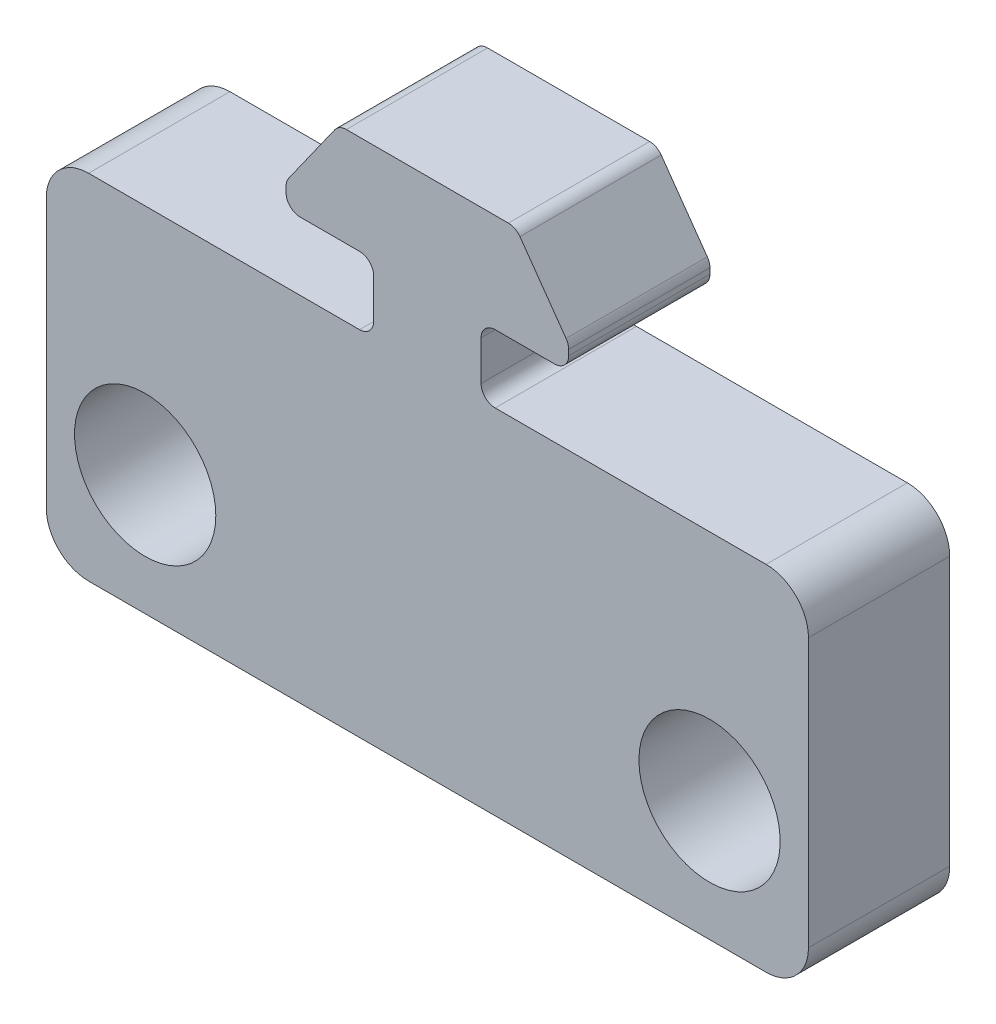
ISO-10303-21;
HEADER;
FILE_DESCRIPTION(('STEP AP214'),'2;1');
FILE_NAME('part.step','',(''),(''),'','','');
FILE_SCHEMA(('AUTOMOTIVE_DESIGN { 1 0 10303 214 1 1 1 1 }'));
ENDSEC;
DATA;
#1=APPLICATION_CONTEXT('core data for automotive mechanical design processes');
#2=APPLICATION_PROTOCOL_DEFINITION('international standard','automotive_design',2000,#1);
#3=PRODUCT_CONTEXT('',#1,'mechanical');
#4=PRODUCT('Part','Part','',(#3));
#5=PRODUCT_RELATED_PRODUCT_CATEGORY('part','',(#4));
#6=PRODUCT_DEFINITION_FORMATION('','',#4);
#7=PRODUCT_DEFINITION_CONTEXT('part definition',#1,'design');
#8=PRODUCT_DEFINITION('design','',#6,#7);
#9=PRODUCT_DEFINITION_SHAPE('','',#8);
#10=(LENGTH_UNIT() NAMED_UNIT(*) SI_UNIT(.MILLI.,.METRE.));
#11=(NAMED_UNIT(*) PLANE_ANGLE_UNIT() SI_UNIT($,.RADIAN.));
#12=(NAMED_UNIT(*) SI_UNIT($,.STERADIAN.) SOLID_ANGLE_UNIT());
#13=UNCERTAINTY_MEASURE_WITH_UNIT(LENGTH_MEASURE(1.E-05),#10,'distance_accuracy_value','');
#14=(GEOMETRIC_REPRESENTATION_CONTEXT(3) GLOBAL_UNCERTAINTY_ASSIGNED_CONTEXT((#13)) GLOBAL_UNIT_ASSIGNED_CONTEXT((#10,
#11,#12)) REPRESENTATION_CONTEXT('',''));
#15=CARTESIAN_POINT('',(0.,0.,0.));
#16=DIRECTION('',(0.,0.,1.));
#17=DIRECTION('',(1.,0.,0.));
#18=AXIS2_PLACEMENT_3D('',#15,#16,#17);
#19=CARTESIAN_POINT('',(0.,0.,10.));
#20=DIRECTION('',(0.,-1.,0.));
#21=DIRECTION('',(0.,0.,-1.));
#22=AXIS2_PLACEMENT_3D('',#19,#20,#21);
#23=PLANE('',#22);
#24=DIRECTION('',(-1.,0.,0.));
#25=VECTOR('',#24,1.);
#26=CARTESIAN_POINT('',(0.,0.,10.));
#27=LINE('',#26,#25);
#28=CARTESIAN_POINT('',(9.,0.,10.));
#29=VERTEX_POINT('',#28);
#30=CARTESIAN_POINT('',(4.8,0.,10.));
#31=VERTEX_POINT('',#30);
#32=EDGE_CURVE('E244',#29,#31,#27,.T.);
#33=ORIENTED_EDGE('',*,*,#32,.T.);
#34=DIRECTION('',(0.,0.,-1.));
#35=VECTOR('',#34,1.);
#36=CARTESIAN_POINT('',(4.8,0.,0.));
#37=LINE('',#36,#35);
#38=CARTESIAN_POINT('',(4.8,0.,0.));
#39=VERTEX_POINT('',#38);
#40=EDGE_CURVE('E349',#31,#39,#37,.T.);
#41=ORIENTED_EDGE('',*,*,#40,.T.);
#42=DIRECTION('',(-1.,0.,0.));
#43=VECTOR('',#42,1.);
#44=CARTESIAN_POINT('',(0.,0.,0.));
#45=LINE('',#44,#43);
#46=CARTESIAN_POINT('',(9.,0.,0.));
#47=VERTEX_POINT('',#46);
#48=EDGE_CURVE('E494',#47,#39,#45,.T.);
#49=ORIENTED_EDGE('',*,*,#48,.F.);
#50=DIRECTION('',(0.,0.,-1.));
#51=VECTOR('',#50,1.);
#52=CARTESIAN_POINT('',(9.,0.,10.));
#53=LINE('',#52,#51);
#54=EDGE_CURVE('E336',#47,#29,#53,.F.);
#55=ORIENTED_EDGE('',*,*,#54,.T.);
#56=EDGE_LOOP('',(#33,#41,#49,#55));
#57=FACE_BOUND('',#56,.T.);
#58=ADVANCED_FACE('F47',(#57),#23,.T.);
#59=CARTESIAN_POINT('',(-4.8,0.,0.));
#60=VERTEX_POINT('',#59);
#61=CARTESIAN_POINT('',(-9.,0.,0.));
#62=VERTEX_POINT('',#61);
#63=EDGE_CURVE('E499',#60,#62,#45,.T.);
#64=ORIENTED_EDGE('',*,*,#63,.F.);
#65=DIRECTION('',(0.,0.,-1.));
#66=VECTOR('',#65,1.);
#67=CARTESIAN_POINT('',(-4.8,0.,10.));
#68=LINE('',#67,#66);
#69=CARTESIAN_POINT('',(-4.8,0.,10.));
#70=VERTEX_POINT('',#69);
#71=EDGE_CURVE('E241',#60,#70,#68,.F.);
#72=ORIENTED_EDGE('',*,*,#71,.T.);
#73=CARTESIAN_POINT('',(-9.,0.,10.));
#74=VERTEX_POINT('',#73);
#75=EDGE_CURVE('E234',#70,#74,#27,.T.);
#76=ORIENTED_EDGE('',*,*,#75,.T.);
#77=DIRECTION('',(0.,0.,-1.));
#78=VECTOR('',#77,1.);
#79=CARTESIAN_POINT('',(-9.,0.,10.));
#80=LINE('',#79,#78);
#81=EDGE_CURVE('E239',#74,#62,#80,.T.);
#82=ORIENTED_EDGE('',*,*,#81,.T.);
#83=EDGE_LOOP('',(#64,#72,#76,#82));
#84=FACE_BOUND('',#83,.T.);
#85=ADVANCED_FACE('F237',(#84),#23,.T.);
#86=CARTESIAN_POINT('',(10.,0.,10.));
#87=DIRECTION('',(-1.,0.,0.));
#88=DIRECTION('',(0.,0.,1.));
#89=AXIS2_PLACEMENT_3D('',#86,#87,#88);
#90=PLANE('',#89);
#91=DIRECTION('',(0.,1.,0.));
#92=VECTOR('',#91,1.);
#93=CARTESIAN_POINT('',(10.,0.,10.));
#94=LINE('',#93,#92);
#95=CARTESIAN_POINT('',(10.,1.,10.));
#96=VERTEX_POINT('',#95);
#97=CARTESIAN_POINT('',(10.,1.39179018720823,10.));
#98=VERTEX_POINT('',#97);
#99=EDGE_CURVE('E479',#96,#98,#94,.T.);
#100=ORIENTED_EDGE('',*,*,#99,.F.);
#101=DIRECTION('',(0.,0.,-1.));
#102=VECTOR('',#101,1.);
#103=CARTESIAN_POINT('',(10.,1.,0.));
#104=LINE('',#103,#102);
#105=CARTESIAN_POINT('',(10.,1.,0.));
#106=VERTEX_POINT('',#105);
#107=EDGE_CURVE('E332',#96,#106,#104,.T.);
#108=ORIENTED_EDGE('',*,*,#107,.T.);
#109=DIRECTION('',(0.,1.,0.));
#110=VECTOR('',#109,1.);
#111=CARTESIAN_POINT('',(10.,0.,0.));
#112=LINE('',#111,#110);
#113=CARTESIAN_POINT('',(10.,1.39179018720823,0.));
#114=VERTEX_POINT('',#113);
#115=EDGE_CURVE('E498',#106,#114,#112,.T.);
#116=ORIENTED_EDGE('',*,*,#115,.T.);
#117=DIRECTION('',(0.,0.,-1.));
#118=VECTOR('',#117,1.);
#119=CARTESIAN_POINT('',(10.,1.39179018720823,10.));
#120=LINE('',#119,#118);
#121=EDGE_CURVE('E329',#114,#98,#120,.F.);
#122=ORIENTED_EDGE('',*,*,#121,.T.);
#123=EDGE_LOOP('',(#100,#108,#116,#122));
#124=FACE_BOUND('',#123,.T.);
#125=ADVANCED_FACE('F553',(#124),#90,.F.);
#126=CARTESIAN_POINT('',(7.46765073306512,5.28686501844186,10.));
#127=DIRECTION('',(-0.816164723344739,-0.57781930079187,0.));
#128=DIRECTION('',(0.57781930079187,-0.816164723344739,0.));
#129=AXIS2_PLACEMENT_3D('',#126,#127,#128);
#130=PLANE('',#129);
#131=DIRECTION('',(-0.57781930079187,0.816164723344739,0.));
#132=VECTOR('',#131,1.);
#133=CARTESIAN_POINT('',(7.46765073306512,5.28686501844186,0.));
#134=LINE('',#133,#132);
#135=CARTESIAN_POINT('',(9.81616472334474,1.9696094880001,0.));
#136=VERTEX_POINT('',#135);
#137=CARTESIAN_POINT('',(6.55369515590563,6.57781930079187,0.));
#138=VERTEX_POINT('',#137);
#139=EDGE_CURVE('E503',#136,#138,#134,.T.);
#140=ORIENTED_EDGE('',*,*,#139,.T.);
#141=DIRECTION('',(0.,0.,-1.));
#142=VECTOR('',#141,1.);
#143=CARTESIAN_POINT('',(6.55369515590563,6.57781930079187,10.));
#144=LINE('',#143,#142);
#145=CARTESIAN_POINT('',(6.55369515590563,6.57781930079187,10.));
#146=VERTEX_POINT('',#145);
#147=EDGE_CURVE('E326',#138,#146,#144,.F.);
#148=ORIENTED_EDGE('',*,*,#147,.T.);
#149=DIRECTION('',(-0.57781930079187,0.816164723344739,0.));
#150=VECTOR('',#149,1.);
#151=CARTESIAN_POINT('',(7.46765073306512,5.28686501844186,10.));
#152=LINE('',#151,#150);
#153=CARTESIAN_POINT('',(9.81616472334474,1.9696094880001,10.));
#154=VERTEX_POINT('',#153);
#155=EDGE_CURVE('E483',#154,#146,#152,.T.);
#156=ORIENTED_EDGE('',*,*,#155,.F.);
#157=DIRECTION('',(0.,0.,-1.));
#158=VECTOR('',#157,1.);
#159=CARTESIAN_POINT('',(9.81616472334474,1.9696094880001,10.));
#160=LINE('',#159,#158);
#161=EDGE_CURVE('E322',#154,#136,#160,.T.);
#162=ORIENTED_EDGE('',*,*,#161,.T.);
#163=EDGE_LOOP('',(#140,#148,#156,#162));
#164=FACE_BOUND('',#163,.T.);
#165=ADVANCED_FACE('F543',(#164),#130,.F.);
#166=CARTESIAN_POINT('',(0.,7.,10.));
#167=DIRECTION('',(0.,1.,0.));
#168=DIRECTION('',(0.,0.,1.));
#169=AXIS2_PLACEMENT_3D('',#166,#167,#168);
#170=PLANE('',#169);
#171=DIRECTION('',(1.,0.,0.));
#172=VECTOR('',#171,1.);
#173=CARTESIAN_POINT('',(0.,7.,0.));
#174=LINE('',#173,#172);
#175=CARTESIAN_POINT('',(-5.73753043256089,7.,0.));
#176=VERTEX_POINT('',#175);
#177=CARTESIAN_POINT('',(5.73753043256089,7.,0.));
#178=VERTEX_POINT('',#177);
#179=EDGE_CURVE('E507',#176,#178,#174,.T.);
#180=ORIENTED_EDGE('',*,*,#179,.F.);
#181=DIRECTION('',(0.,0.,-1.));
#182=VECTOR('',#181,1.);
#183=CARTESIAN_POINT('',(-5.73753043256089,7.,10.));
#184=LINE('',#183,#182);
#185=CARTESIAN_POINT('',(-5.73753043256089,7.,10.));
#186=VERTEX_POINT('',#185);
#187=EDGE_CURVE('E319',#176,#186,#184,.F.);
#188=ORIENTED_EDGE('',*,*,#187,.T.);
#189=DIRECTION('',(1.,0.,0.));
#190=VECTOR('',#189,1.);
#191=CARTESIAN_POINT('',(0.,7.,10.));
#192=LINE('',#191,#190);
#193=CARTESIAN_POINT('',(5.73753043256089,7.,10.));
#194=VERTEX_POINT('',#193);
#195=EDGE_CURVE('E487',#186,#194,#192,.T.);
#196=ORIENTED_EDGE('',*,*,#195,.T.);
#197=DIRECTION('',(0.,0.,-1.));
#198=VECTOR('',#197,1.);
#199=CARTESIAN_POINT('',(5.73753043256089,7.,0.));
#200=LINE('',#199,#198);
#201=EDGE_CURVE('E315',#194,#178,#200,.T.);
#202=ORIENTED_EDGE('',*,*,#201,.T.);
#203=EDGE_LOOP('',(#180,#188,#196,#202));
#204=FACE_BOUND('',#203,.T.);
#205=ADVANCED_FACE('F535',(#204),#170,.T.);
#206=CARTESIAN_POINT('',(-7.46765073306512,5.28686501844186,10.));
#207=DIRECTION('',(-0.816164723344739,0.57781930079187,0.));
#208=DIRECTION('',(-0.57781930079187,-0.816164723344739,0.));
#209=AXIS2_PLACEMENT_3D('',#206,#207,#208);
#210=PLANE('',#209);
#211=DIRECTION('',(0.57781930079187,0.816164723344739,0.));
#212=VECTOR('',#211,1.);
#213=CARTESIAN_POINT('',(-7.46765073306512,5.28686501844186,0.));
#214=LINE('',#213,#212);
#215=CARTESIAN_POINT('',(-9.81616472334474,1.9696094880001,0.));
#216=VERTEX_POINT('',#215);
#217=CARTESIAN_POINT('',(-6.55369515590563,6.57781930079187,0.));
#218=VERTEX_POINT('',#217);
#219=EDGE_CURVE('E510',#216,#218,#214,.T.);
#220=ORIENTED_EDGE('',*,*,#219,.F.);
#221=DIRECTION('',(0.,0.,-1.));
#222=VECTOR('',#221,1.);
#223=CARTESIAN_POINT('',(-9.81616472334474,1.9696094880001,10.));
#224=LINE('',#223,#222);
#225=CARTESIAN_POINT('',(-9.81616472334474,1.9696094880001,10.));
#226=VERTEX_POINT('',#225);
#227=EDGE_CURVE('E312',#216,#226,#224,.F.);
#228=ORIENTED_EDGE('',*,*,#227,.T.);
#229=DIRECTION('',(0.57781930079187,0.816164723344739,0.));
#230=VECTOR('',#229,1.);
#231=CARTESIAN_POINT('',(-7.46765073306512,5.28686501844186,10.));
#232=LINE('',#231,#230);
#233=CARTESIAN_POINT('',(-6.55369515590563,6.57781930079187,10.));
#234=VERTEX_POINT('',#233);
#235=EDGE_CURVE('E270',#226,#234,#232,.T.);
#236=ORIENTED_EDGE('',*,*,#235,.T.);
#237=DIRECTION('',(0.,0.,-1.));
#238=VECTOR('',#237,1.);
#239=CARTESIAN_POINT('',(-6.55369515590563,6.57781930079187,10.));
#240=LINE('',#239,#238);
#241=EDGE_CURVE('E257',#234,#218,#240,.T.);
#242=ORIENTED_EDGE('',*,*,#241,.T.);
#243=EDGE_LOOP('',(#220,#228,#236,#242));
#244=FACE_BOUND('',#243,.T.);
#245=ADVANCED_FACE('F526',(#244),#210,.T.);
#246=CARTESIAN_POINT('',(-10.,0.,10.));
#247=DIRECTION('',(-1.,0.,0.));
#248=DIRECTION('',(0.,0.,1.));
#249=AXIS2_PLACEMENT_3D('',#246,#247,#248);
#250=PLANE('',#249);
#251=DIRECTION('',(0.,1.,0.));
#252=VECTOR('',#251,1.);
#253=CARTESIAN_POINT('',(-10.,0.,0.));
#254=LINE('',#253,#252);
#255=CARTESIAN_POINT('',(-10.,1.,0.));
#256=VERTEX_POINT('',#255);
#257=CARTESIAN_POINT('',(-10.,1.39179018720823,0.));
#258=VERTEX_POINT('',#257);
#259=EDGE_CURVE('E245',#256,#258,#254,.T.);
#260=ORIENTED_EDGE('',*,*,#259,.F.);
#261=DIRECTION('',(0.,0.,-1.));
#262=VECTOR('',#261,1.);
#263=CARTESIAN_POINT('',(-10.,1.,10.));
#264=LINE('',#263,#262);
#265=CARTESIAN_POINT('',(-10.,1.,10.));
#266=VERTEX_POINT('',#265);
#267=EDGE_CURVE('E292',#256,#266,#264,.F.);
#268=ORIENTED_EDGE('',*,*,#267,.T.);
#269=DIRECTION('',(0.,1.,0.));
#270=VECTOR('',#269,1.);
#271=CARTESIAN_POINT('',(-10.,0.,10.));
#272=LINE('',#271,#270);
#273=CARTESIAN_POINT('',(-10.,1.39179018720823,10.));
#274=VERTEX_POINT('',#273);
#275=EDGE_CURVE('E253',#266,#274,#272,.T.);
#276=ORIENTED_EDGE('',*,*,#275,.T.);
#277=DIRECTION('',(0.,0.,-1.));
#278=VECTOR('',#277,1.);
#279=CARTESIAN_POINT('',(-10.,1.39179018720823,10.));
#280=LINE('',#279,#278);
#281=EDGE_CURVE('E288',#274,#258,#280,.T.);
#282=ORIENTED_EDGE('',*,*,#281,.T.);
#283=EDGE_LOOP('',(#260,#268,#276,#282));
#284=FACE_BOUND('',#283,.T.);
#285=ADVANCED_FACE('F518',(#284),#250,.T.);
#286=CARTESIAN_POINT('',(0.,0.,10.));
#287=DIRECTION('',(0.,0.,1.));
#288=DIRECTION('',(1.,0.,0.));
#289=AXIS2_PLACEMENT_3D('',#286,#287,#288);
#290=PLANE('',#289);
#291=CARTESIAN_POINT('',(-19.9733887839906,-21.2885545569876,10.));
#292=DIRECTION('',(0.,0.,1.));
#293=DIRECTION('',(1.,0.,0.));
#294=AXIS2_PLACEMENT_3D('',#291,#292,#293);
#295=CIRCLE('',#294,5.);
#296=CARTESIAN_POINT('',(-14.9733887839906,-21.2885545569876,10.));
#297=VERTEX_POINT('',#296);
#298=EDGE_CURVE('E457',#297,#297,#295,.T.);
#299=ORIENTED_EDGE('',*,*,#298,.F.);
#300=EDGE_LOOP('',(#299));
#301=FACE_BOUND('',#300,.T.);
#302=CARTESIAN_POINT('',(19.9733887839906,-21.2885545569876,10.));
#303=DIRECTION('',(0.,0.,1.));
#304=DIRECTION('',(-1.,0.,0.));
#305=AXIS2_PLACEMENT_3D('',#302,#303,#304);
#306=CIRCLE('',#305,5.);
#307=CARTESIAN_POINT('',(14.9733887839906,-21.2885545569876,10.));
#308=VERTEX_POINT('',#307);
#309=EDGE_CURVE('E920',#308,#308,#306,.T.);
#310=ORIENTED_EDGE('',*,*,#309,.F.);
#311=EDGE_LOOP('',(#310));
#312=FACE_BOUND('',#311,.T.);
#313=DIRECTION('',(-1.,0.,0.));
#314=VECTOR('',#313,1.);
#315=CARTESIAN_POINT('',(0.,-4.8,10.));
#316=LINE('',#315,#314);
#317=CARTESIAN_POINT('',(-4.8,-4.8,10.));
#318=VERTEX_POINT('',#317);
#319=CARTESIAN_POINT('',(-23.9733887839906,-4.8,10.));
#320=VERTEX_POINT('',#319);
#321=EDGE_CURVE('E599',#318,#320,#316,.T.);
#322=ORIENTED_EDGE('',*,*,#321,.T.);
#323=CARTESIAN_POINT('',(-23.9733887839906,-7.8,10.));
#324=DIRECTION('',(0.,0.,1.));
#325=DIRECTION('',(1.,0.,0.));
#326=AXIS2_PLACEMENT_3D('',#323,#324,#325);
#327=CIRCLE('',#326,3.);
#328=CARTESIAN_POINT('',(-26.9733887839906,-7.8,10.));
#329=VERTEX_POINT('',#328);
#330=EDGE_CURVE('E419',#320,#329,#327,.T.);
#331=ORIENTED_EDGE('',*,*,#330,.T.);
#332=DIRECTION('',(0.,-1.,0.));
#333=VECTOR('',#332,1.);
#334=CARTESIAN_POINT('',(-26.9733887839906,0.,10.));
#335=LINE('',#334,#333);
#336=CARTESIAN_POINT('',(-26.9733887839905,-26.8,10.));
#337=VERTEX_POINT('',#336);
#338=EDGE_CURVE('E601',#329,#337,#335,.T.);
#339=ORIENTED_EDGE('',*,*,#338,.T.);
#340=CARTESIAN_POINT('',(-23.9733887839905,-26.8,10.));
#341=DIRECTION('',(0.,0.,1.));
#342=DIRECTION('',(1.,0.,0.));
#343=AXIS2_PLACEMENT_3D('',#340,#341,#342);
#344=CIRCLE('',#343,3.);
#345=CARTESIAN_POINT('',(-23.9733887839905,-29.8,10.));
#346=VERTEX_POINT('',#345);
#347=EDGE_CURVE('E416',#337,#346,#344,.T.);
#348=ORIENTED_EDGE('',*,*,#347,.T.);
#349=DIRECTION('',(1.,0.,0.));
#350=VECTOR('',#349,1.);
#351=CARTESIAN_POINT('',(0.,-29.8,10.));
#352=LINE('',#351,#350);
#353=CARTESIAN_POINT('',(23.9733887839906,-29.8,10.));
#354=VERTEX_POINT('',#353);
#355=EDGE_CURVE('E475',#346,#354,#352,.T.);
#356=ORIENTED_EDGE('',*,*,#355,.T.);
#357=CARTESIAN_POINT('',(23.9733887839906,-26.8,10.));
#358=DIRECTION('',(0.,0.,1.));
#359=DIRECTION('',(1.,0.,0.));
#360=AXIS2_PLACEMENT_3D('',#357,#358,#359);
#361=CIRCLE('',#360,3.);
#362=CARTESIAN_POINT('',(26.9733887839906,-26.8,10.));
#363=VERTEX_POINT('',#362);
#364=EDGE_CURVE('E69',#354,#363,#361,.T.);
#365=ORIENTED_EDGE('',*,*,#364,.T.);
#366=DIRECTION('',(0.,-1.,0.));
#367=VECTOR('',#366,1.);
#368=CARTESIAN_POINT('',(26.9733887839906,0.,10.));
#369=LINE('',#368,#367);
#370=CARTESIAN_POINT('',(26.9733887839906,-7.8,10.));
#371=VERTEX_POINT('',#370);
#372=EDGE_CURVE('E441',#371,#363,#369,.T.);
#373=ORIENTED_EDGE('',*,*,#372,.F.);
#374=CARTESIAN_POINT('',(23.9733887839906,-7.8,10.));
#375=DIRECTION('',(0.,0.,1.));
#376=DIRECTION('',(1.,0.,0.));
#377=AXIS2_PLACEMENT_3D('',#374,#375,#376);
#378=CIRCLE('',#377,3.);
#379=CARTESIAN_POINT('',(23.9733887839906,-4.8,10.));
#380=VERTEX_POINT('',#379);
#381=EDGE_CURVE('E63',#371,#380,#378,.T.);
#382=ORIENTED_EDGE('',*,*,#381,.T.);
#383=DIRECTION('',(1.,0.,0.));
#384=VECTOR('',#383,1.);
#385=CARTESIAN_POINT('',(0.,-4.8,10.));
#386=LINE('',#385,#384);
#387=CARTESIAN_POINT('',(4.8,-4.8,10.));
#388=VERTEX_POINT('',#387);
#389=EDGE_CURVE('E582',#388,#380,#386,.T.);
#390=ORIENTED_EDGE('',*,*,#389,.F.);
#391=CARTESIAN_POINT('',(4.8,-3.8,10.));
#392=DIRECTION('',(0.,0.,1.));
#393=DIRECTION('',(1.,0.,0.));
#394=AXIS2_PLACEMENT_3D('',#391,#392,#393);
#395=CIRCLE('',#394,1.);
#396=CARTESIAN_POINT('',(3.8,-3.8,10.));
#397=VERTEX_POINT('',#396);
#398=EDGE_CURVE('E369',#388,#397,#395,.F.);
#399=ORIENTED_EDGE('',*,*,#398,.T.);
#400=DIRECTION('',(0.,-1.,0.));
#401=VECTOR('',#400,1.);
#402=CARTESIAN_POINT('',(3.8,0.,10.));
#403=LINE('',#402,#401);
#404=CARTESIAN_POINT('',(3.8,-1.,10.));
#405=VERTEX_POINT('',#404);
#406=EDGE_CURVE('E573',#405,#397,#403,.T.);
#407=ORIENTED_EDGE('',*,*,#406,.F.);
#408=CARTESIAN_POINT('',(4.8,-1.,10.));
#409=DIRECTION('',(0.,0.,1.));
#410=DIRECTION('',(1.,0.,0.));
#411=AXIS2_PLACEMENT_3D('',#408,#409,#410);
#412=CIRCLE('',#411,1.);
#413=EDGE_CURVE('E375',#405,#31,#412,.F.);
#414=ORIENTED_EDGE('',*,*,#413,.T.);
#415=ORIENTED_EDGE('',*,*,#32,.F.);
#416=CARTESIAN_POINT('',(9.,1.,10.));
#417=DIRECTION('',(0.,0.,1.));
#418=DIRECTION('',(1.,0.,0.));
#419=AXIS2_PLACEMENT_3D('',#416,#417,#418);
#420=CIRCLE('',#419,1.);
#421=EDGE_CURVE('E298',#29,#96,#420,.T.);
#422=ORIENTED_EDGE('',*,*,#421,.T.);
#423=ORIENTED_EDGE('',*,*,#99,.T.);
#424=CARTESIAN_POINT('',(9.,1.39179018720823,10.));
#425=DIRECTION('',(0.,0.,1.));
#426=DIRECTION('',(1.,0.,0.));
#427=AXIS2_PLACEMENT_3D('',#424,#425,#426);
#428=CIRCLE('',#427,1.);
#429=EDGE_CURVE('E295',#98,#154,#428,.T.);
#430=ORIENTED_EDGE('',*,*,#429,.T.);
#431=ORIENTED_EDGE('',*,*,#155,.T.);
#432=CARTESIAN_POINT('',(5.73753043256089,6.,10.));
#433=DIRECTION('',(0.,0.,1.));
#434=DIRECTION('',(1.,0.,0.));
#435=AXIS2_PLACEMENT_3D('',#432,#433,#434);
#436=CIRCLE('',#435,1.);
#437=EDGE_CURVE('E301',#146,#194,#436,.T.);
#438=ORIENTED_EDGE('',*,*,#437,.T.);
#439=ORIENTED_EDGE('',*,*,#195,.F.);
#440=CARTESIAN_POINT('',(-5.73753043256089,6.,10.));
#441=DIRECTION('',(0.,0.,1.));
#442=DIRECTION('',(1.,0.,0.));
#443=AXIS2_PLACEMENT_3D('',#440,#441,#442);
#444=CIRCLE('',#443,1.);
#445=EDGE_CURVE('E304',#186,#234,#444,.T.);
#446=ORIENTED_EDGE('',*,*,#445,.T.);
#447=ORIENTED_EDGE('',*,*,#235,.F.);
#448=CARTESIAN_POINT('',(-9.,1.39179018720823,10.));
#449=DIRECTION('',(0.,0.,1.));
#450=DIRECTION('',(1.,0.,0.));
#451=AXIS2_PLACEMENT_3D('',#448,#449,#450);
#452=CIRCLE('',#451,1.);
#453=EDGE_CURVE('E258',#226,#274,#452,.T.);
#454=ORIENTED_EDGE('',*,*,#453,.T.);
#455=ORIENTED_EDGE('',*,*,#275,.F.);
#456=CARTESIAN_POINT('',(-9.,1.,10.));
#457=DIRECTION('',(0.,0.,1.));
#458=DIRECTION('',(1.,0.,0.));
#459=AXIS2_PLACEMENT_3D('',#456,#457,#458);
#460=CIRCLE('',#459,1.);
#461=EDGE_CURVE('E249',#266,#74,#460,.T.);
#462=ORIENTED_EDGE('',*,*,#461,.T.);
#463=ORIENTED_EDGE('',*,*,#75,.F.);
#464=CARTESIAN_POINT('',(-4.8,-1.,10.));
#465=DIRECTION('',(0.,0.,1.));
#466=DIRECTION('',(1.,0.,0.));
#467=AXIS2_PLACEMENT_3D('',#464,#465,#466);
#468=CIRCLE('',#467,1.);
#469=CARTESIAN_POINT('',(-3.8,-1.,10.));
#470=VERTEX_POINT('',#469);
#471=EDGE_CURVE('E387',#70,#470,#468,.F.);
#472=ORIENTED_EDGE('',*,*,#471,.T.);
#473=DIRECTION('',(0.,-1.,0.));
#474=VECTOR('',#473,1.);
#475=CARTESIAN_POINT('',(-3.8,0.,10.));
#476=LINE('',#475,#474);
#477=CARTESIAN_POINT('',(-3.8,-3.8,10.));
#478=VERTEX_POINT('',#477);
#479=EDGE_CURVE('E595',#470,#478,#476,.T.);
#480=ORIENTED_EDGE('',*,*,#479,.T.);
#481=CARTESIAN_POINT('',(-4.8,-3.8,10.));
#482=DIRECTION('',(0.,0.,1.));
#483=DIRECTION('',(1.,0.,0.));
#484=AXIS2_PLACEMENT_3D('',#481,#482,#483);
#485=CIRCLE('',#484,1.);
#486=EDGE_CURVE('E381',#478,#318,#485,.F.);
#487=ORIENTED_EDGE('',*,*,#486,.T.);
#488=EDGE_LOOP('',(#322,#331,#339,#348,#356,#365,#373,#382,#390,#399,#407,#414,#415,#422,#423,
#430,#431,#438,#439,#446,#447,#454,#455,#462,#463,#472,#480,#487));
#489=FACE_BOUND('',#488,.T.);
#490=ADVANCED_FACE('F251',(#301,#312,#489),#290,.T.);
#491=CARTESIAN_POINT('',(0.,0.,0.));
#492=DIRECTION('',(0.,0.,1.));
#493=DIRECTION('',(1.,0.,0.));
#494=AXIS2_PLACEMENT_3D('',#491,#492,#493);
#495=PLANE('',#494);
#496=CARTESIAN_POINT('',(-19.9733887839906,-21.2885545569876,0.));
#497=DIRECTION('',(0.,0.,1.));
#498=DIRECTION('',(1.,0.,0.));
#499=AXIS2_PLACEMENT_3D('',#496,#497,#498);
#500=CIRCLE('',#499,5.);
#501=CARTESIAN_POINT('',(-14.9733887839906,-21.2885545569876,0.));
#502=VERTEX_POINT('',#501);
#503=EDGE_CURVE('E925',#502,#502,#500,.T.);
#504=ORIENTED_EDGE('',*,*,#503,.T.);
#505=EDGE_LOOP('',(#504));
#506=FACE_BOUND('',#505,.T.);
#507=CARTESIAN_POINT('',(19.9733887839906,-21.2885545569876,0.));
#508=DIRECTION('',(0.,0.,1.));
#509=DIRECTION('',(-1.,0.,0.));
#510=AXIS2_PLACEMENT_3D('',#507,#508,#509);
#511=CIRCLE('',#510,5.);
#512=CARTESIAN_POINT('',(14.9733887839906,-21.2885545569876,0.));
#513=VERTEX_POINT('',#512);
#514=EDGE_CURVE('E922',#513,#513,#511,.T.);
#515=ORIENTED_EDGE('',*,*,#514,.T.);
#516=EDGE_LOOP('',(#515));
#517=FACE_BOUND('',#516,.T.);
#518=DIRECTION('',(0.,-1.,0.));
#519=VECTOR('',#518,1.);
#520=CARTESIAN_POINT('',(-26.9733887839906,0.,0.));
#521=LINE('',#520,#519);
#522=CARTESIAN_POINT('',(-26.9733887839906,-7.8,0.));
#523=VERTEX_POINT('',#522);
#524=CARTESIAN_POINT('',(-26.9733887839905,-26.8,0.));
#525=VERTEX_POINT('',#524);
#526=EDGE_CURVE('E472',#523,#525,#521,.T.);
#527=ORIENTED_EDGE('',*,*,#526,.F.);
#528=CARTESIAN_POINT('',(-23.9733887839906,-7.8,0.));
#529=DIRECTION('',(0.,0.,1.));
#530=DIRECTION('',(1.,0.,0.));
#531=AXIS2_PLACEMENT_3D('',#528,#529,#530);
#532=CIRCLE('',#531,3.);
#533=CARTESIAN_POINT('',(-23.9733887839906,-4.8,0.));
#534=VERTEX_POINT('',#533);
#535=EDGE_CURVE('E406',#523,#534,#532,.F.);
#536=ORIENTED_EDGE('',*,*,#535,.T.);
#537=DIRECTION('',(-1.,0.,0.));
#538=VECTOR('',#537,1.);
#539=CARTESIAN_POINT('',(0.,-4.8,0.));
#540=LINE('',#539,#538);
#541=CARTESIAN_POINT('',(-4.8,-4.8,0.));
#542=VERTEX_POINT('',#541);
#543=EDGE_CURVE('E468',#542,#534,#540,.T.);
#544=ORIENTED_EDGE('',*,*,#543,.F.);
#545=CARTESIAN_POINT('',(-4.8,-3.8,0.));
#546=DIRECTION('',(0.,0.,1.));
#547=DIRECTION('',(1.,0.,0.));
#548=AXIS2_PLACEMENT_3D('',#545,#546,#547);
#549=CIRCLE('',#548,1.);
#550=CARTESIAN_POINT('',(-3.8,-3.8,0.));
#551=VERTEX_POINT('',#550);
#552=EDGE_CURVE('E378',#542,#551,#549,.T.);
#553=ORIENTED_EDGE('',*,*,#552,.T.);
#554=DIRECTION('',(0.,-1.,0.));
#555=VECTOR('',#554,1.);
#556=CARTESIAN_POINT('',(-3.8,0.,0.));
#557=LINE('',#556,#555);
#558=CARTESIAN_POINT('',(-3.8,-1.,0.));
#559=VERTEX_POINT('',#558);
#560=EDGE_CURVE('E464',#559,#551,#557,.T.);
#561=ORIENTED_EDGE('',*,*,#560,.F.);
#562=CARTESIAN_POINT('',(-4.8,-1.,0.));
#563=DIRECTION('',(0.,0.,1.));
#564=DIRECTION('',(1.,0.,0.));
#565=AXIS2_PLACEMENT_3D('',#562,#563,#564);
#566=CIRCLE('',#565,1.);
#567=EDGE_CURVE('E384',#559,#60,#566,.T.);
#568=ORIENTED_EDGE('',*,*,#567,.T.);
#569=ORIENTED_EDGE('',*,*,#63,.T.);
#570=CARTESIAN_POINT('',(-9.,1.,0.));
#571=DIRECTION('',(0.,0.,1.));
#572=DIRECTION('',(1.,0.,0.));
#573=AXIS2_PLACEMENT_3D('',#570,#571,#572);
#574=CIRCLE('',#573,1.);
#575=EDGE_CURVE('E262',#62,#256,#574,.F.);
#576=ORIENTED_EDGE('',*,*,#575,.T.);
#577=ORIENTED_EDGE('',*,*,#259,.T.);
#578=CARTESIAN_POINT('',(-9.,1.39179018720823,0.));
#579=DIRECTION('',(0.,0.,1.));
#580=DIRECTION('',(1.,0.,0.));
#581=AXIS2_PLACEMENT_3D('',#578,#579,#580);
#582=CIRCLE('',#581,1.);
#583=EDGE_CURVE('E283',#258,#216,#582,.F.);
#584=ORIENTED_EDGE('',*,*,#583,.T.);
#585=ORIENTED_EDGE('',*,*,#219,.T.);
#586=CARTESIAN_POINT('',(-5.73753043256089,6.,0.));
#587=DIRECTION('',(0.,0.,1.));
#588=DIRECTION('',(1.,0.,0.));
#589=AXIS2_PLACEMENT_3D('',#586,#587,#588);
#590=CIRCLE('',#589,1.);
#591=EDGE_CURVE('E280',#218,#176,#590,.F.);
#592=ORIENTED_EDGE('',*,*,#591,.T.);
#593=ORIENTED_EDGE('',*,*,#179,.T.);
#594=CARTESIAN_POINT('',(5.73753043256089,6.,0.));
#595=DIRECTION('',(0.,0.,1.));
#596=DIRECTION('',(1.,0.,0.));
#597=AXIS2_PLACEMENT_3D('',#594,#595,#596);
#598=CIRCLE('',#597,1.);
#599=EDGE_CURVE('E277',#178,#138,#598,.F.);
#600=ORIENTED_EDGE('',*,*,#599,.T.);
#601=ORIENTED_EDGE('',*,*,#139,.F.);
#602=CARTESIAN_POINT('',(9.,1.39179018720823,0.));
#603=DIRECTION('',(0.,0.,1.));
#604=DIRECTION('',(1.,0.,0.));
#605=AXIS2_PLACEMENT_3D('',#602,#603,#604);
#606=CIRCLE('',#605,1.);
#607=EDGE_CURVE('E264',#136,#114,#606,.F.);
#608=ORIENTED_EDGE('',*,*,#607,.T.);
#609=ORIENTED_EDGE('',*,*,#115,.F.);
#610=CARTESIAN_POINT('',(9.,1.,0.));
#611=DIRECTION('',(0.,0.,1.));
#612=DIRECTION('',(1.,0.,0.));
#613=AXIS2_PLACEMENT_3D('',#610,#611,#612);
#614=CIRCLE('',#613,1.);
#615=EDGE_CURVE('E268',#106,#47,#614,.F.);
#616=ORIENTED_EDGE('',*,*,#615,.T.);
#617=ORIENTED_EDGE('',*,*,#48,.T.);
#618=CARTESIAN_POINT('',(4.8,-1.,0.));
#619=DIRECTION('',(0.,0.,1.));
#620=DIRECTION('',(1.,0.,0.));
#621=AXIS2_PLACEMENT_3D('',#618,#619,#620);
#622=CIRCLE('',#621,1.);
#623=CARTESIAN_POINT('',(3.8,-1.,0.));
#624=VERTEX_POINT('',#623);
#625=EDGE_CURVE('E372',#39,#624,#622,.T.);
#626=ORIENTED_EDGE('',*,*,#625,.T.);
#627=DIRECTION('',(0.,-1.,0.));
#628=VECTOR('',#627,1.);
#629=CARTESIAN_POINT('',(3.8,0.,0.));
#630=LINE('',#629,#628);
#631=CARTESIAN_POINT('',(3.8,-3.8,0.));
#632=VERTEX_POINT('',#631);
#633=EDGE_CURVE('E455',#624,#632,#630,.T.);
#634=ORIENTED_EDGE('',*,*,#633,.T.);
#635=CARTESIAN_POINT('',(4.8,-3.8,0.));
#636=DIRECTION('',(0.,0.,1.));
#637=DIRECTION('',(1.,0.,0.));
#638=AXIS2_PLACEMENT_3D('',#635,#636,#637);
#639=CIRCLE('',#638,1.);
#640=CARTESIAN_POINT('',(4.8,-4.8,0.));
#641=VERTEX_POINT('',#640);
#642=EDGE_CURVE('E366',#632,#641,#639,.T.);
#643=ORIENTED_EDGE('',*,*,#642,.T.);
#644=DIRECTION('',(1.,0.,0.));
#645=VECTOR('',#644,1.);
#646=CARTESIAN_POINT('',(0.,-4.8,0.));
#647=LINE('',#646,#645);
#648=CARTESIAN_POINT('',(23.9733887839906,-4.8,0.));
#649=VERTEX_POINT('',#648);
#650=EDGE_CURVE('E450',#641,#649,#647,.T.);
#651=ORIENTED_EDGE('',*,*,#650,.T.);
#652=CARTESIAN_POINT('',(23.9733887839906,-7.8,0.));
#653=DIRECTION('',(0.,0.,1.));
#654=DIRECTION('',(1.,0.,0.));
#655=AXIS2_PLACEMENT_3D('',#652,#653,#654);
#656=CIRCLE('',#655,3.);
#657=CARTESIAN_POINT('',(26.9733887839906,-7.8,0.));
#658=VERTEX_POINT('',#657);
#659=EDGE_CURVE('E400',#649,#658,#656,.F.);
#660=ORIENTED_EDGE('',*,*,#659,.T.);
#661=DIRECTION('',(0.,-1.,0.));
#662=VECTOR('',#661,1.);
#663=CARTESIAN_POINT('',(26.9733887839906,0.,0.));
#664=LINE('',#663,#662);
#665=CARTESIAN_POINT('',(26.9733887839906,-26.8,0.));
#666=VERTEX_POINT('',#665);
#667=EDGE_CURVE('E439',#658,#666,#664,.T.);
#668=ORIENTED_EDGE('',*,*,#667,.T.);
#669=CARTESIAN_POINT('',(23.9733887839906,-26.8,0.));
#670=DIRECTION('',(0.,0.,1.));
#671=DIRECTION('',(1.,0.,0.));
#672=AXIS2_PLACEMENT_3D('',#669,#670,#671);
#673=CIRCLE('',#672,3.);
#674=CARTESIAN_POINT('',(23.9733887839906,-29.8,0.));
#675=VERTEX_POINT('',#674);
#676=EDGE_CURVE('E397',#666,#675,#673,.F.);
#677=ORIENTED_EDGE('',*,*,#676,.T.);
#678=DIRECTION('',(1.,0.,0.));
#679=VECTOR('',#678,1.);
#680=CARTESIAN_POINT('',(0.,-29.8,0.));
#681=LINE('',#680,#679);
#682=CARTESIAN_POINT('',(-23.9733887839905,-29.8,0.));
#683=VERTEX_POINT('',#682);
#684=EDGE_CURVE('E451',#683,#675,#681,.T.);
#685=ORIENTED_EDGE('',*,*,#684,.F.);
#686=CARTESIAN_POINT('',(-23.9733887839905,-26.8,0.));
#687=DIRECTION('',(0.,0.,1.));
#688=DIRECTION('',(1.,0.,0.));
#689=AXIS2_PLACEMENT_3D('',#686,#687,#688);
#690=CIRCLE('',#689,3.);
#691=EDGE_CURVE('E403',#683,#525,#690,.F.);
#692=ORIENTED_EDGE('',*,*,#691,.T.);
#693=EDGE_LOOP('',(#527,#536,#544,#553,#561,#568,#569,#576,#577,#584,#585,#592,#593,#600,#601,
#608,#609,#616,#617,#626,#634,#643,#651,#660,#668,#677,#685,#692));
#694=FACE_BOUND('',#693,.T.);
#695=ADVANCED_FACE('F445',(#506,#517,#694),#495,.F.);
#696=CARTESIAN_POINT('',(0.,-29.8,10.));
#697=DIRECTION('',(0.,1.,0.));
#698=DIRECTION('',(-1.,0.,0.));
#699=AXIS2_PLACEMENT_3D('',#696,#697,#698);
#700=PLANE('',#699);
#701=ORIENTED_EDGE('',*,*,#355,.F.);
#702=DIRECTION('',(0.,0.,-1.));
#703=VECTOR('',#702,1.);
#704=CARTESIAN_POINT('',(-23.9733887839905,-29.8,10.));
#705=LINE('',#704,#703);
#706=EDGE_CURVE('E425',#346,#683,#705,.T.);
#707=ORIENTED_EDGE('',*,*,#706,.T.);
#708=ORIENTED_EDGE('',*,*,#684,.T.);
#709=DIRECTION('',(0.,0.,-1.));
#710=VECTOR('',#709,1.);
#711=CARTESIAN_POINT('',(23.9733887839906,-29.8,10.));
#712=LINE('',#711,#710);
#713=EDGE_CURVE('E422',#675,#354,#712,.F.);
#714=ORIENTED_EDGE('',*,*,#713,.T.);
#715=EDGE_LOOP('',(#701,#707,#708,#714));
#716=FACE_BOUND('',#715,.T.);
#717=ADVANCED_FACE('F636',(#716),#700,.F.);
#718=CARTESIAN_POINT('',(26.9733887839906,0.,10.));
#719=DIRECTION('',(1.,0.,0.));
#720=DIRECTION('',(0.,1.,0.));
#721=AXIS2_PLACEMENT_3D('',#718,#719,#720);
#722=PLANE('',#721);
#723=ORIENTED_EDGE('',*,*,#667,.F.);
#724=DIRECTION('',(0.,0.,-1.));
#725=VECTOR('',#724,1.);
#726=CARTESIAN_POINT('',(26.9733887839906,-7.8,10.));
#727=LINE('',#726,#725);
#728=EDGE_CURVE('E11',#658,#371,#727,.F.);
#729=ORIENTED_EDGE('',*,*,#728,.T.);
#730=ORIENTED_EDGE('',*,*,#372,.T.);
#731=DIRECTION('',(0.,0.,-1.));
#732=VECTOR('',#731,1.);
#733=CARTESIAN_POINT('',(26.9733887839906,-26.8,0.));
#734=LINE('',#733,#732);
#735=EDGE_CURVE('E56',#363,#666,#734,.T.);
#736=ORIENTED_EDGE('',*,*,#735,.T.);
#737=EDGE_LOOP('',(#723,#729,#730,#736));
#738=FACE_BOUND('',#737,.T.);
#739=ADVANCED_FACE('F438',(#738),#722,.T.);
#740=CARTESIAN_POINT('',(0.,-4.8,10.));
#741=DIRECTION('',(0.,1.,0.));
#742=DIRECTION('',(-1.,0.,0.));
#743=AXIS2_PLACEMENT_3D('',#740,#741,#742);
#744=PLANE('',#743);
#745=ORIENTED_EDGE('',*,*,#389,.T.);
#746=DIRECTION('',(0.,0.,-1.));
#747=VECTOR('',#746,1.);
#748=CARTESIAN_POINT('',(23.9733887839906,-4.8,10.));
#749=LINE('',#748,#747);
#750=EDGE_CURVE('E429',#380,#649,#749,.T.);
#751=ORIENTED_EDGE('',*,*,#750,.T.);
#752=ORIENTED_EDGE('',*,*,#650,.F.);
#753=DIRECTION('',(0.,0.,-1.));
#754=VECTOR('',#753,1.);
#755=CARTESIAN_POINT('',(4.8,-4.8,10.));
#756=LINE('',#755,#754);
#757=EDGE_CURVE('E346',#641,#388,#756,.F.);
#758=ORIENTED_EDGE('',*,*,#757,.T.);
#759=EDGE_LOOP('',(#745,#751,#752,#758));
#760=FACE_BOUND('',#759,.T.);
#761=ADVANCED_FACE('F580',(#760),#744,.T.);
#762=CARTESIAN_POINT('',(3.8,0.,10.));
#763=DIRECTION('',(1.,0.,0.));
#764=DIRECTION('',(0.,1.,0.));
#765=AXIS2_PLACEMENT_3D('',#762,#763,#764);
#766=PLANE('',#765);
#767=ORIENTED_EDGE('',*,*,#406,.T.);
#768=DIRECTION('',(0.,0.,-1.));
#769=VECTOR('',#768,1.);
#770=CARTESIAN_POINT('',(3.8,-3.8,0.));
#771=LINE('',#770,#769);
#772=EDGE_CURVE('E342',#397,#632,#771,.T.);
#773=ORIENTED_EDGE('',*,*,#772,.T.);
#774=ORIENTED_EDGE('',*,*,#633,.F.);
#775=DIRECTION('',(0.,0.,-1.));
#776=VECTOR('',#775,1.);
#777=CARTESIAN_POINT('',(3.8,-1.,10.));
#778=LINE('',#777,#776);
#779=EDGE_CURVE('E339',#624,#405,#778,.F.);
#780=ORIENTED_EDGE('',*,*,#779,.T.);
#781=EDGE_LOOP('',(#767,#773,#774,#780));
#782=FACE_BOUND('',#781,.T.);
#783=ADVANCED_FACE('F570',(#782),#766,.T.);
#784=CARTESIAN_POINT('',(-3.8,0.,10.));
#785=DIRECTION('',(1.,0.,0.));
#786=DIRECTION('',(0.,1.,0.));
#787=AXIS2_PLACEMENT_3D('',#784,#785,#786);
#788=PLANE('',#787);
#789=ORIENTED_EDGE('',*,*,#560,.T.);
#790=DIRECTION('',(0.,0.,-1.));
#791=VECTOR('',#790,1.);
#792=CARTESIAN_POINT('',(-3.8,-3.8,10.));
#793=LINE('',#792,#791);
#794=EDGE_CURVE('E361',#551,#478,#793,.F.);
#795=ORIENTED_EDGE('',*,*,#794,.T.);
#796=ORIENTED_EDGE('',*,*,#479,.F.);
#797=DIRECTION('',(0.,0.,-1.));
#798=VECTOR('',#797,1.);
#799=CARTESIAN_POINT('',(-3.8,-1.,10.));
#800=LINE('',#799,#798);
#801=EDGE_CURVE('E357',#470,#559,#800,.T.);
#802=ORIENTED_EDGE('',*,*,#801,.T.);
#803=EDGE_LOOP('',(#789,#795,#796,#802));
#804=FACE_BOUND('',#803,.T.);
#805=ADVANCED_FACE('F614',(#804),#788,.F.);
#806=CARTESIAN_POINT('',(0.,-4.8,10.));
#807=DIRECTION('',(0.,-1.,0.));
#808=DIRECTION('',(1.,0.,0.));
#809=AXIS2_PLACEMENT_3D('',#806,#807,#808);
#810=PLANE('',#809);
#811=ORIENTED_EDGE('',*,*,#543,.T.);
#812=DIRECTION('',(0.,0.,-1.));
#813=VECTOR('',#812,1.);
#814=CARTESIAN_POINT('',(-23.9733887839906,-4.8,10.));
#815=LINE('',#814,#813);
#816=EDGE_CURVE('E409',#534,#320,#815,.F.);
#817=ORIENTED_EDGE('',*,*,#816,.T.);
#818=ORIENTED_EDGE('',*,*,#321,.F.);
#819=DIRECTION('',(0.,0.,-1.));
#820=VECTOR('',#819,1.);
#821=CARTESIAN_POINT('',(-4.8,-4.8,0.));
#822=LINE('',#821,#820);
#823=EDGE_CURVE('E353',#318,#542,#822,.T.);
#824=ORIENTED_EDGE('',*,*,#823,.T.);
#825=EDGE_LOOP('',(#811,#817,#818,#824));
#826=FACE_BOUND('',#825,.T.);
#827=ADVANCED_FACE('F622',(#826),#810,.F.);
#828=CARTESIAN_POINT('',(-26.9733887839906,0.,10.));
#829=DIRECTION('',(1.,0.,0.));
#830=DIRECTION('',(0.,1.,0.));
#831=AXIS2_PLACEMENT_3D('',#828,#829,#830);
#832=PLANE('',#831);
#833=ORIENTED_EDGE('',*,*,#338,.F.);
#834=DIRECTION('',(0.,0.,-1.));
#835=VECTOR('',#834,1.);
#836=CARTESIAN_POINT('',(-26.9733887839906,-7.8,10.));
#837=LINE('',#836,#835);
#838=EDGE_CURVE('E393',#329,#523,#837,.T.);
#839=ORIENTED_EDGE('',*,*,#838,.T.);
#840=ORIENTED_EDGE('',*,*,#526,.T.);
#841=DIRECTION('',(0.,0.,-1.));
#842=VECTOR('',#841,1.);
#843=CARTESIAN_POINT('',(-26.9733887839905,-26.8,10.));
#844=LINE('',#843,#842);
#845=EDGE_CURVE('E390',#525,#337,#844,.F.);
#846=ORIENTED_EDGE('',*,*,#845,.T.);
#847=EDGE_LOOP('',(#833,#839,#840,#846));
#848=FACE_BOUND('',#847,.T.);
#849=ADVANCED_FACE('F629',(#848),#832,.F.);
#850=CARTESIAN_POINT('',(19.9733887839906,-21.2885545569876,10.));
#851=DIRECTION('',(0.,0.,-1.));
#852=DIRECTION('',(-1.,0.,0.));
#853=AXIS2_PLACEMENT_3D('',#850,#851,#852);
#854=CYLINDRICAL_SURFACE('',#853,5.);
#855=ORIENTED_EDGE('',*,*,#309,.T.);
#856=EDGE_LOOP('',(#855));
#857=FACE_BOUND('',#856,.T.);
#858=ORIENTED_EDGE('',*,*,#514,.F.);
#859=EDGE_LOOP('',(#858));
#860=FACE_BOUND('',#859,.T.);
#861=ADVANCED_FACE('F752',(#857,#860),#854,.F.);
#862=CARTESIAN_POINT('',(-19.9733887839906,-21.2885545569876,10.));
#863=DIRECTION('',(0.,0.,-1.));
#864=DIRECTION('',(-1.,0.,0.));
#865=AXIS2_PLACEMENT_3D('',#862,#863,#864);
#866=CYLINDRICAL_SURFACE('',#865,5.);
#867=ORIENTED_EDGE('',*,*,#298,.T.);
#868=EDGE_LOOP('',(#867));
#869=FACE_BOUND('',#868,.T.);
#870=ORIENTED_EDGE('',*,*,#503,.F.);
#871=EDGE_LOOP('',(#870));
#872=FACE_BOUND('',#871,.T.);
#873=ADVANCED_FACE('F653',(#869,#872),#866,.F.);
#874=CARTESIAN_POINT('',(-9.,1.,10.));
#875=DIRECTION('',(0.,0.,-1.));
#876=DIRECTION('',(-1.,0.,0.));
#877=AXIS2_PLACEMENT_3D('',#874,#875,#876);
#878=CYLINDRICAL_SURFACE('',#877,1.);
#879=ORIENTED_EDGE('',*,*,#461,.F.);
#880=ORIENTED_EDGE('',*,*,#267,.F.);
#881=ORIENTED_EDGE('',*,*,#575,.F.);
#882=ORIENTED_EDGE('',*,*,#81,.F.);
#883=EDGE_LOOP('',(#879,#880,#881,#882));
#884=FACE_BOUND('',#883,.T.);
#885=ADVANCED_FACE('F261',(#884),#878,.T.);
#886=CARTESIAN_POINT('',(-9.,1.39179018720823,10.));
#887=DIRECTION('',(0.,0.,-1.));
#888=DIRECTION('',(-1.,0.,0.));
#889=AXIS2_PLACEMENT_3D('',#886,#887,#888);
#890=CYLINDRICAL_SURFACE('',#889,1.);
#891=ORIENTED_EDGE('',*,*,#453,.F.);
#892=ORIENTED_EDGE('',*,*,#227,.F.);
#893=ORIENTED_EDGE('',*,*,#583,.F.);
#894=ORIENTED_EDGE('',*,*,#281,.F.);
#895=EDGE_LOOP('',(#891,#892,#893,#894));
#896=FACE_BOUND('',#895,.T.);
#897=ADVANCED_FACE('F522',(#896),#890,.T.);
#898=CARTESIAN_POINT('',(-5.73753043256089,6.,10.));
#899=DIRECTION('',(0.,0.,-1.));
#900=DIRECTION('',(-1.,0.,0.));
#901=AXIS2_PLACEMENT_3D('',#898,#899,#900);
#902=CYLINDRICAL_SURFACE('',#901,1.);
#903=ORIENTED_EDGE('',*,*,#445,.F.);
#904=ORIENTED_EDGE('',*,*,#187,.F.);
#905=ORIENTED_EDGE('',*,*,#591,.F.);
#906=ORIENTED_EDGE('',*,*,#241,.F.);
#907=EDGE_LOOP('',(#903,#904,#905,#906));
#908=FACE_BOUND('',#907,.T.);
#909=ADVANCED_FACE('F532',(#908),#902,.T.);
#910=CARTESIAN_POINT('',(5.73753043256089,6.,10.));
#911=DIRECTION('',(0.,0.,1.));
#912=DIRECTION('',(1.,0.,0.));
#913=AXIS2_PLACEMENT_3D('',#910,#911,#912);
#914=CYLINDRICAL_SURFACE('',#913,1.);
#915=ORIENTED_EDGE('',*,*,#437,.F.);
#916=ORIENTED_EDGE('',*,*,#147,.F.);
#917=ORIENTED_EDGE('',*,*,#599,.F.);
#918=ORIENTED_EDGE('',*,*,#201,.F.);
#919=EDGE_LOOP('',(#915,#916,#917,#918));
#920=FACE_BOUND('',#919,.T.);
#921=ADVANCED_FACE('F539',(#920),#914,.T.);
#922=CARTESIAN_POINT('',(9.,1.,10.));
#923=DIRECTION('',(0.,0.,1.));
#924=DIRECTION('',(1.,0.,0.));
#925=AXIS2_PLACEMENT_3D('',#922,#923,#924);
#926=CYLINDRICAL_SURFACE('',#925,1.);
#927=ORIENTED_EDGE('',*,*,#421,.F.);
#928=ORIENTED_EDGE('',*,*,#54,.F.);
#929=ORIENTED_EDGE('',*,*,#615,.F.);
#930=ORIENTED_EDGE('',*,*,#107,.F.);
#931=EDGE_LOOP('',(#927,#928,#929,#930));
#932=FACE_BOUND('',#931,.T.);
#933=ADVANCED_FACE('F557',(#932),#926,.T.);
#934=CARTESIAN_POINT('',(9.,1.39179018720823,10.));
#935=DIRECTION('',(0.,0.,-1.));
#936=DIRECTION('',(-1.,0.,0.));
#937=AXIS2_PLACEMENT_3D('',#934,#935,#936);
#938=CYLINDRICAL_SURFACE('',#937,1.);
#939=ORIENTED_EDGE('',*,*,#429,.F.);
#940=ORIENTED_EDGE('',*,*,#121,.F.);
#941=ORIENTED_EDGE('',*,*,#607,.F.);
#942=ORIENTED_EDGE('',*,*,#161,.F.);
#943=EDGE_LOOP('',(#939,#940,#941,#942));
#944=FACE_BOUND('',#943,.T.);
#945=ADVANCED_FACE('F548',(#944),#938,.T.);
#946=CARTESIAN_POINT('',(4.8,-3.8,10.));
#947=DIRECTION('',(0.,0.,1.));
#948=DIRECTION('',(1.,0.,0.));
#949=AXIS2_PLACEMENT_3D('',#946,#947,#948);
#950=CYLINDRICAL_SURFACE('',#949,1.);
#951=ORIENTED_EDGE('',*,*,#398,.F.);
#952=ORIENTED_EDGE('',*,*,#757,.F.);
#953=ORIENTED_EDGE('',*,*,#642,.F.);
#954=ORIENTED_EDGE('',*,*,#772,.F.);
#955=EDGE_LOOP('',(#951,#952,#953,#954));
#956=FACE_BOUND('',#955,.T.);
#957=ADVANCED_FACE('F576',(#956),#950,.F.);
#958=CARTESIAN_POINT('',(4.8,-1.,10.));
#959=DIRECTION('',(0.,0.,1.));
#960=DIRECTION('',(1.,0.,0.));
#961=AXIS2_PLACEMENT_3D('',#958,#959,#960);
#962=CYLINDRICAL_SURFACE('',#961,1.);
#963=ORIENTED_EDGE('',*,*,#413,.F.);
#964=ORIENTED_EDGE('',*,*,#779,.F.);
#965=ORIENTED_EDGE('',*,*,#625,.F.);
#966=ORIENTED_EDGE('',*,*,#40,.F.);
#967=EDGE_LOOP('',(#963,#964,#965,#966));
#968=FACE_BOUND('',#967,.T.);
#969=ADVANCED_FACE('F565',(#968),#962,.F.);
#970=CARTESIAN_POINT('',(-4.8,-3.8,10.));
#971=DIRECTION('',(0.,0.,1.));
#972=DIRECTION('',(1.,0.,0.));
#973=AXIS2_PLACEMENT_3D('',#970,#971,#972);
#974=CYLINDRICAL_SURFACE('',#973,1.);
#975=ORIENTED_EDGE('',*,*,#486,.F.);
#976=ORIENTED_EDGE('',*,*,#794,.F.);
#977=ORIENTED_EDGE('',*,*,#552,.F.);
#978=ORIENTED_EDGE('',*,*,#823,.F.);
#979=EDGE_LOOP('',(#975,#976,#977,#978));
#980=FACE_BOUND('',#979,.T.);
#981=ADVANCED_FACE('F617',(#980),#974,.F.);
#982=CARTESIAN_POINT('',(-4.8,-1.,10.));
#983=DIRECTION('',(0.,0.,-1.));
#984=DIRECTION('',(-1.,0.,0.));
#985=AXIS2_PLACEMENT_3D('',#982,#983,#984);
#986=CYLINDRICAL_SURFACE('',#985,1.);
#987=ORIENTED_EDGE('',*,*,#471,.F.);
#988=ORIENTED_EDGE('',*,*,#71,.F.);
#989=ORIENTED_EDGE('',*,*,#567,.F.);
#990=ORIENTED_EDGE('',*,*,#801,.F.);
#991=EDGE_LOOP('',(#987,#988,#989,#990));
#992=FACE_BOUND('',#991,.T.);
#993=ADVANCED_FACE('F609',(#992),#986,.F.);
#994=CARTESIAN_POINT('',(-23.9733887839906,-7.8,10.));
#995=DIRECTION('',(0.,0.,-1.));
#996=DIRECTION('',(-1.,0.,0.));
#997=AXIS2_PLACEMENT_3D('',#994,#995,#996);
#998=CYLINDRICAL_SURFACE('',#997,3.);
#999=ORIENTED_EDGE('',*,*,#330,.F.);
#1000=ORIENTED_EDGE('',*,*,#816,.F.);
#1001=ORIENTED_EDGE('',*,*,#535,.F.);
#1002=ORIENTED_EDGE('',*,*,#838,.F.);
#1003=EDGE_LOOP('',(#999,#1000,#1001,#1002));
#1004=FACE_BOUND('',#1003,.T.);
#1005=ADVANCED_FACE('F626',(#1004),#998,.T.);
#1006=CARTESIAN_POINT('',(-23.9733887839905,-26.8,10.));
#1007=DIRECTION('',(0.,0.,-1.));
#1008=DIRECTION('',(-1.,0.,0.));
#1009=AXIS2_PLACEMENT_3D('',#1006,#1007,#1008);
#1010=CYLINDRICAL_SURFACE('',#1009,3.);
#1011=ORIENTED_EDGE('',*,*,#347,.F.);
#1012=ORIENTED_EDGE('',*,*,#845,.F.);
#1013=ORIENTED_EDGE('',*,*,#691,.F.);
#1014=ORIENTED_EDGE('',*,*,#706,.F.);
#1015=EDGE_LOOP('',(#1011,#1012,#1013,#1014));
#1016=FACE_BOUND('',#1015,.T.);
#1017=ADVANCED_FACE('F632',(#1016),#1010,.T.);
#1018=CARTESIAN_POINT('',(23.9733887839906,-7.8,10.));
#1019=DIRECTION('',(0.,0.,-1.));
#1020=DIRECTION('',(-1.,0.,0.));
#1021=AXIS2_PLACEMENT_3D('',#1018,#1019,#1020);
#1022=CYLINDRICAL_SURFACE('',#1021,3.);
#1023=ORIENTED_EDGE('',*,*,#381,.F.);
#1024=ORIENTED_EDGE('',*,*,#728,.F.);
#1025=ORIENTED_EDGE('',*,*,#659,.F.);
#1026=ORIENTED_EDGE('',*,*,#750,.F.);
#1027=EDGE_LOOP('',(#1023,#1024,#1025,#1026));
#1028=FACE_BOUND('',#1027,.T.);
#1029=ADVANCED_FACE('F584',(#1028),#1022,.T.);
#1030=CARTESIAN_POINT('',(23.9733887839906,-26.8,10.));
#1031=DIRECTION('',(0.,0.,1.));
#1032=DIRECTION('',(1.,0.,0.));
#1033=AXIS2_PLACEMENT_3D('',#1030,#1031,#1032);
#1034=CYLINDRICAL_SURFACE('',#1033,3.);
#1035=ORIENTED_EDGE('',*,*,#364,.F.);
#1036=ORIENTED_EDGE('',*,*,#713,.F.);
#1037=ORIENTED_EDGE('',*,*,#676,.F.);
#1038=ORIENTED_EDGE('',*,*,#735,.F.);
#1039=EDGE_LOOP('',(#1035,#1036,#1037,#1038));
#1040=FACE_BOUND('',#1039,.T.);
#1041=ADVANCED_FACE('F49',(#1040),#1034,.T.);
#1042=CLOSED_SHELL('',(#58,#85,#125,#165,#205,#245,#285,#490,#695,#717,#739,#761,#783,#805,#827,
#849,#861,#873,#885,#897,#909,#921,#933,#945,#957,#969,#981,#993,#1005,#1017,#1029,#1041));
#1043=MANIFOLD_SOLID_BREP('B2',#1042);
#1044=ADVANCED_BREP_SHAPE_REPRESENTATION('',(#18,#1043),#14);
#1045=SHAPE_DEFINITION_REPRESENTATION(#9,#1044);
ENDSEC;
END-ISO-10303-21;
